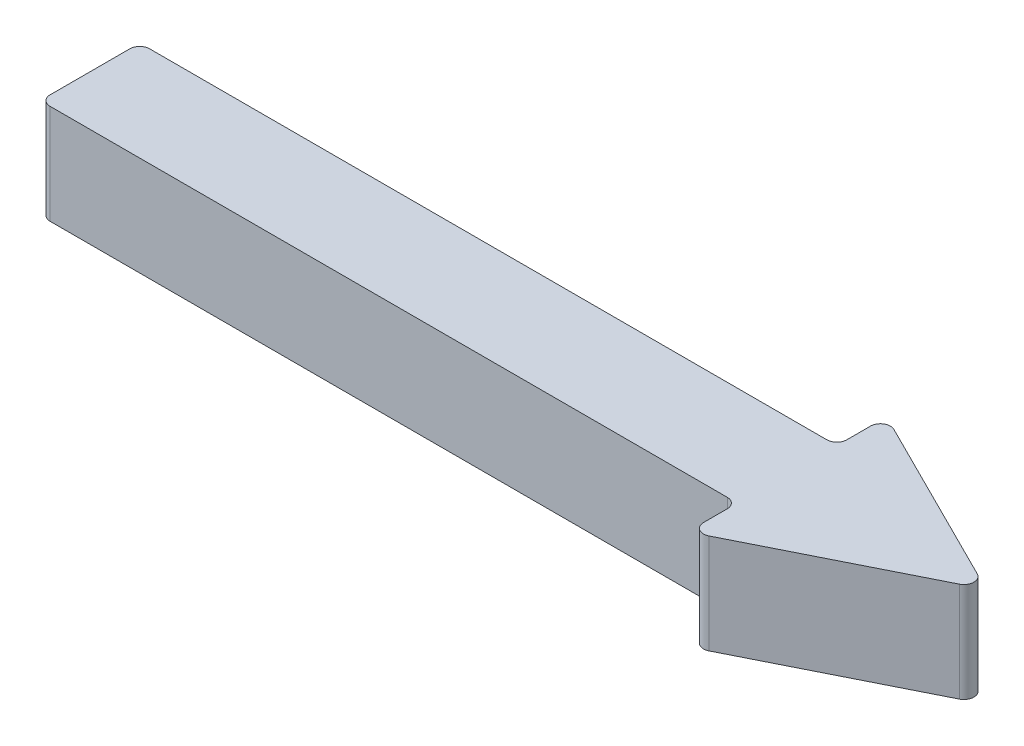
ISO-10303-21;
HEADER;
FILE_DESCRIPTION(('STEP AP214'),'2;1');
FILE_NAME('part.step','',(''),(''),'','','');
FILE_SCHEMA(('AUTOMOTIVE_DESIGN { 1 0 10303 214 1 1 1 1 }'));
ENDSEC;
DATA;
#1=APPLICATION_CONTEXT('core data for automotive mechanical design processes');
#2=APPLICATION_PROTOCOL_DEFINITION('international standard','automotive_design',2000,#1);
#3=PRODUCT_CONTEXT('',#1,'mechanical');
#4=PRODUCT('Part','Part','',(#3));
#5=PRODUCT_RELATED_PRODUCT_CATEGORY('part','',(#4));
#6=PRODUCT_DEFINITION_FORMATION('','',#4);
#7=PRODUCT_DEFINITION_CONTEXT('part definition',#1,'design');
#8=PRODUCT_DEFINITION('design','',#6,#7);
#9=PRODUCT_DEFINITION_SHAPE('','',#8);
#10=(LENGTH_UNIT() NAMED_UNIT(*) SI_UNIT(.MILLI.,.METRE.));
#11=(NAMED_UNIT(*) PLANE_ANGLE_UNIT() SI_UNIT($,.RADIAN.));
#12=(NAMED_UNIT(*) SI_UNIT($,.STERADIAN.) SOLID_ANGLE_UNIT());
#13=UNCERTAINTY_MEASURE_WITH_UNIT(LENGTH_MEASURE(1.E-05),#10,'distance_accuracy_value','');
#14=(GEOMETRIC_REPRESENTATION_CONTEXT(3) GLOBAL_UNCERTAINTY_ASSIGNED_CONTEXT((#13)) GLOBAL_UNIT_ASSIGNED_CONTEXT((#10,
#11,#12)) REPRESENTATION_CONTEXT('',''));
#15=CARTESIAN_POINT('',(0.,0.,0.));
#16=DIRECTION('',(0.,0.,1.));
#17=DIRECTION('',(1.,0.,0.));
#18=AXIS2_PLACEMENT_3D('',#15,#16,#17);
#19=CARTESIAN_POINT('',(0.,0.,0.));
#20=DIRECTION('',(0.,1.,0.));
#21=DIRECTION('',(0.,0.,1.));
#22=AXIS2_PLACEMENT_3D('',#19,#20,#21);
#23=PLANE('',#22);
#24=CARTESIAN_POINT('',(20.5625484171438,0.,-3.17500000000001));
#25=DIRECTION('',(0.,-1.,0.));
#26=DIRECTION('',(0.,0.,-1.));
#27=AXIS2_PLACEMENT_3D('',#24,#25,#26);
#28=CIRCLE('',#27,0.889);
#29=CARTESIAN_POINT('',(20.5625484171438,0.,-4.06400000000001));
#30=VERTEX_POINT('',#29);
#31=EDGE_CURVE('E266',#30,#30,#28,.T.);
#32=ORIENTED_EDGE('',*,*,#31,.F.);
#33=EDGE_LOOP('',(#32));
#34=FACE_BOUND('',#33,.T.);
#35=DIRECTION('',(1.,0.,0.));
#36=VECTOR('',#35,1.);
#37=CARTESIAN_POINT('',(0.,0.,0.));
#38=LINE('',#37,#36);
#39=CARTESIAN_POINT('',(0.635,0.,0.));
#40=VERTEX_POINT('',#39);
#41=CARTESIAN_POINT('',(43.815,0.,0.));
#42=VERTEX_POINT('',#41);
#43=EDGE_CURVE('E154',#40,#42,#38,.T.);
#44=ORIENTED_EDGE('',*,*,#43,.F.);
#45=CARTESIAN_POINT('',(0.635,0.,-0.635));
#46=DIRECTION('',(0.,1.,0.));
#47=DIRECTION('',(0.,0.,1.));
#48=AXIS2_PLACEMENT_3D('',#45,#46,#47);
#49=CIRCLE('',#48,0.635);
#50=CARTESIAN_POINT('',(0.,0.,-0.635));
#51=VERTEX_POINT('',#50);
#52=EDGE_CURVE('E137',#40,#51,#49,.F.);
#53=ORIENTED_EDGE('',*,*,#52,.T.);
#54=DIRECTION('',(0.,0.,-1.));
#55=VECTOR('',#54,1.);
#56=CARTESIAN_POINT('',(0.,0.,0.));
#57=LINE('',#56,#55);
#58=CARTESIAN_POINT('',(0.,0.,-5.715));
#59=VERTEX_POINT('',#58);
#60=EDGE_CURVE('E164',#51,#59,#57,.T.);
#61=ORIENTED_EDGE('',*,*,#60,.T.);
#62=CARTESIAN_POINT('',(0.635,0.,-5.715));
#63=DIRECTION('',(0.,1.,0.));
#64=DIRECTION('',(0.,0.,1.));
#65=AXIS2_PLACEMENT_3D('',#62,#63,#64);
#66=CIRCLE('',#65,0.635);
#67=CARTESIAN_POINT('',(0.635,0.,-6.35));
#68=VERTEX_POINT('',#67);
#69=EDGE_CURVE('E148',#59,#68,#66,.F.);
#70=ORIENTED_EDGE('',*,*,#69,.T.);
#71=DIRECTION('',(1.,0.,0.));
#72=VECTOR('',#71,1.);
#73=CARTESIAN_POINT('',(0.,0.,-6.35));
#74=LINE('',#73,#72);
#75=CARTESIAN_POINT('',(43.815,0.,-6.35));
#76=VERTEX_POINT('',#75);
#77=EDGE_CURVE('E180',#68,#76,#74,.T.);
#78=ORIENTED_EDGE('',*,*,#77,.T.);
#79=CARTESIAN_POINT('',(43.815,0.,-6.985));
#80=DIRECTION('',(0.,1.,0.));
#81=DIRECTION('',(0.,0.,1.));
#82=AXIS2_PLACEMENT_3D('',#79,#80,#81);
#83=CIRCLE('',#82,0.635);
#84=CARTESIAN_POINT('',(44.45,0.,-6.985));
#85=VERTEX_POINT('',#84);
#86=EDGE_CURVE('E229',#76,#85,#83,.T.);
#87=ORIENTED_EDGE('',*,*,#86,.T.);
#88=DIRECTION('',(0.,0.,-1.));
#89=VECTOR('',#88,1.);
#90=CARTESIAN_POINT('',(44.45,0.,0.));
#91=LINE('',#90,#89);
#92=CARTESIAN_POINT('',(44.45,0.,-8.49754841714382));
#93=VERTEX_POINT('',#92);
#94=EDGE_CURVE('E177',#85,#93,#91,.T.);
#95=ORIENTED_EDGE('',*,*,#94,.T.);
#96=CARTESIAN_POINT('',(45.085,0.,-8.49754841714382));
#97=DIRECTION('',(0.,1.,0.));
#98=DIRECTION('',(0.,0.,1.));
#99=AXIS2_PLACEMENT_3D('',#96,#97,#98);
#100=CIRCLE('',#99,0.635);
#101=CARTESIAN_POINT('',(45.3689806331425,0.,-9.06550968342878));
#102=VERTEX_POINT('',#101);
#103=EDGE_CURVE('E187',#93,#102,#100,.F.);
#104=ORIENTED_EDGE('',*,*,#103,.T.);
#105=DIRECTION('',(0.894427190999916,0.,0.447213595499958));
#106=VECTOR('',#105,1.);
#107=CARTESIAN_POINT('',(12.7,0.,-25.4));
#108=LINE('',#107,#106);
#109=CARTESIAN_POINT('',(56.0140774674301,0.,-3.74296126628495));
#110=VERTEX_POINT('',#109);
#111=EDGE_CURVE('E174',#102,#110,#108,.T.);
#112=ORIENTED_EDGE('',*,*,#111,.T.);
#113=CARTESIAN_POINT('',(55.7300968342876,0.,-3.175));
#114=DIRECTION('',(0.,1.,0.));
#115=DIRECTION('',(0.,0.,1.));
#116=AXIS2_PLACEMENT_3D('',#113,#114,#115);
#117=CIRCLE('',#116,0.635);
#118=CARTESIAN_POINT('',(56.0140774674301,0.,-2.60703873371505));
#119=VERTEX_POINT('',#118);
#120=EDGE_CURVE('E158',#110,#119,#117,.F.);
#121=ORIENTED_EDGE('',*,*,#120,.T.);
#122=DIRECTION('',(-0.894427190999916,0.,0.447213595499957));
#123=VECTOR('',#122,1.);
#124=CARTESIAN_POINT('',(10.16,0.,20.32));
#125=LINE('',#124,#123);
#126=CARTESIAN_POINT('',(45.3689806331425,0.,2.71550968342876));
#127=VERTEX_POINT('',#126);
#128=EDGE_CURVE('E166',#119,#127,#125,.T.);
#129=ORIENTED_EDGE('',*,*,#128,.T.);
#130=CARTESIAN_POINT('',(45.085,0.,2.14754841714381));
#131=DIRECTION('',(0.,1.,0.));
#132=DIRECTION('',(0.,0.,1.));
#133=AXIS2_PLACEMENT_3D('',#130,#131,#132);
#134=CIRCLE('',#133,0.635);
#135=CARTESIAN_POINT('',(44.45,0.,2.14754841714381));
#136=VERTEX_POINT('',#135);
#137=EDGE_CURVE('E189',#127,#136,#134,.F.);
#138=ORIENTED_EDGE('',*,*,#137,.T.);
#139=DIRECTION('',(0.,0.,-1.));
#140=VECTOR('',#139,1.);
#141=CARTESIAN_POINT('',(44.45,0.,0.));
#142=LINE('',#141,#140);
#143=CARTESIAN_POINT('',(44.45,0.,0.634999999999984));
#144=VERTEX_POINT('',#143);
#145=EDGE_CURVE('E163',#136,#144,#142,.T.);
#146=ORIENTED_EDGE('',*,*,#145,.T.);
#147=CARTESIAN_POINT('',(43.815,0.,0.634999999999984));
#148=DIRECTION('',(0.,1.,0.));
#149=DIRECTION('',(0.,0.,1.));
#150=AXIS2_PLACEMENT_3D('',#147,#148,#149);
#151=CIRCLE('',#150,0.635);
#152=EDGE_CURVE('E43',#144,#42,#151,.T.);
#153=ORIENTED_EDGE('',*,*,#152,.T.);
#154=EDGE_LOOP('',(#44,#53,#61,#70,#78,#87,#95,#104,#112,#121,#129,#138,#146,#153));
#155=FACE_BOUND('',#154,.T.);
#156=CARTESIAN_POINT('',(35.8025484171438,0.,-3.17500000000001));
#157=DIRECTION('',(0.,1.,0.));
#158=DIRECTION('',(0.,0.,1.));
#159=AXIS2_PLACEMENT_3D('',#156,#157,#158);
#160=CIRCLE('',#159,0.888999999999996);
#161=CARTESIAN_POINT('',(35.8025484171438,0.,-4.064));
#162=VERTEX_POINT('',#161);
#163=EDGE_CURVE('E269',#162,#162,#160,.T.);
#164=ORIENTED_EDGE('',*,*,#163,.T.);
#165=EDGE_LOOP('',(#164));
#166=FACE_BOUND('',#165,.T.);
#167=ADVANCED_FACE('F35',(#34,#155,#166),#23,.F.);
#168=CARTESIAN_POINT('',(0.,6.35,0.));
#169=DIRECTION('',(-1.,0.,0.));
#170=DIRECTION('',(0.,0.,1.));
#171=AXIS2_PLACEMENT_3D('',#168,#169,#170);
#172=PLANE('',#171);
#173=CARTESIAN_POINT('',(0.,3.175,-3.175));
#174=DIRECTION('',(-1.,0.,0.));
#175=DIRECTION('',(0.,0.,1.));
#176=AXIS2_PLACEMENT_3D('',#173,#174,#175);
#177=CIRCLE('',#176,2.4003);
#178=CARTESIAN_POINT('',(0.,3.175,-0.774700000000001));
#179=VERTEX_POINT('',#178);
#180=EDGE_CURVE('E257',#179,#179,#177,.T.);
#181=ORIENTED_EDGE('',*,*,#180,.F.);
#182=EDGE_LOOP('',(#181));
#183=FACE_BOUND('',#182,.T.);
#184=ORIENTED_EDGE('',*,*,#60,.F.);
#185=DIRECTION('',(0.,-1.,0.));
#186=VECTOR('',#185,1.);
#187=CARTESIAN_POINT('',(0.,6.35,-0.635));
#188=LINE('',#187,#186);
#189=CARTESIAN_POINT('',(0.,6.35,-0.635));
#190=VERTEX_POINT('',#189);
#191=EDGE_CURVE('E142',#51,#190,#188,.F.);
#192=ORIENTED_EDGE('',*,*,#191,.T.);
#193=DIRECTION('',(0.,0.,-1.));
#194=VECTOR('',#193,1.);
#195=CARTESIAN_POINT('',(0.,6.35,0.));
#196=LINE('',#195,#194);
#197=CARTESIAN_POINT('',(0.,6.35,-5.715));
#198=VERTEX_POINT('',#197);
#199=EDGE_CURVE('E183',#190,#198,#196,.T.);
#200=ORIENTED_EDGE('',*,*,#199,.T.);
#201=DIRECTION('',(0.,-1.,0.));
#202=VECTOR('',#201,1.);
#203=CARTESIAN_POINT('',(0.,6.35,-5.715));
#204=LINE('',#203,#202);
#205=EDGE_CURVE('E147',#198,#59,#204,.T.);
#206=ORIENTED_EDGE('',*,*,#205,.T.);
#207=EDGE_LOOP('',(#184,#192,#200,#206));
#208=FACE_BOUND('',#207,.T.);
#209=ADVANCED_FACE('F287',(#183,#208),#172,.T.);
#210=CARTESIAN_POINT('',(0.,6.35,0.));
#211=DIRECTION('',(0.,0.,-1.));
#212=DIRECTION('',(-1.,0.,0.));
#213=AXIS2_PLACEMENT_3D('',#210,#211,#212);
#214=PLANE('',#213);
#215=DIRECTION('',(1.,0.,0.));
#216=VECTOR('',#215,1.);
#217=CARTESIAN_POINT('',(0.,6.35,0.));
#218=LINE('',#217,#216);
#219=CARTESIAN_POINT('',(0.635,6.35,0.));
#220=VERTEX_POINT('',#219);
#221=CARTESIAN_POINT('',(43.815,6.35,0.));
#222=VERTEX_POINT('',#221);
#223=EDGE_CURVE('E157',#220,#222,#218,.T.);
#224=ORIENTED_EDGE('',*,*,#223,.F.);
#225=DIRECTION('',(0.,-1.,0.));
#226=VECTOR('',#225,1.);
#227=CARTESIAN_POINT('',(0.635,0.,0.));
#228=LINE('',#227,#226);
#229=EDGE_CURVE('E141',#220,#40,#228,.T.);
#230=ORIENTED_EDGE('',*,*,#229,.T.);
#231=ORIENTED_EDGE('',*,*,#43,.T.);
#232=DIRECTION('',(0.,-1.,0.));
#233=VECTOR('',#232,1.);
#234=CARTESIAN_POINT('',(43.815,6.35,0.));
#235=LINE('',#234,#233);
#236=EDGE_CURVE('E159',#42,#222,#235,.F.);
#237=ORIENTED_EDGE('',*,*,#236,.T.);
#238=EDGE_LOOP('',(#224,#230,#231,#237));
#239=FACE_BOUND('',#238,.T.);
#240=ADVANCED_FACE('F153',(#239),#214,.F.);
#241=CARTESIAN_POINT('',(44.45,6.35,0.));
#242=DIRECTION('',(-1.,0.,0.));
#243=DIRECTION('',(0.,0.,1.));
#244=AXIS2_PLACEMENT_3D('',#241,#242,#243);
#245=PLANE('',#244);
#246=DIRECTION('',(0.,0.,-1.));
#247=VECTOR('',#246,1.);
#248=CARTESIAN_POINT('',(44.45,6.35,0.));
#249=LINE('',#248,#247);
#250=CARTESIAN_POINT('',(44.45,6.35,2.14754841714381));
#251=VERTEX_POINT('',#250);
#252=CARTESIAN_POINT('',(44.45,6.35,0.634999999999984));
#253=VERTEX_POINT('',#252);
#254=EDGE_CURVE('E251',#251,#253,#249,.T.);
#255=ORIENTED_EDGE('',*,*,#254,.T.);
#256=DIRECTION('',(0.,-1.,0.));
#257=VECTOR('',#256,1.);
#258=CARTESIAN_POINT('',(44.45,6.35,0.634999999999984));
#259=LINE('',#258,#257);
#260=EDGE_CURVE('E216',#253,#144,#259,.T.);
#261=ORIENTED_EDGE('',*,*,#260,.T.);
#262=ORIENTED_EDGE('',*,*,#145,.F.);
#263=DIRECTION('',(0.,-1.,0.));
#264=VECTOR('',#263,1.);
#265=CARTESIAN_POINT('',(44.45,6.35,2.14754841714381));
#266=LINE('',#265,#264);
#267=EDGE_CURVE('E214',#136,#251,#266,.F.);
#268=ORIENTED_EDGE('',*,*,#267,.T.);
#269=EDGE_LOOP('',(#255,#261,#262,#268));
#270=FACE_BOUND('',#269,.T.);
#271=ADVANCED_FACE('F311',(#270),#245,.T.);
#272=CARTESIAN_POINT('',(10.16,6.35,20.32));
#273=DIRECTION('',(0.447213595499957,0.,0.894427190999916));
#274=DIRECTION('',(0.894427190999916,0.,-0.447213595499957));
#275=AXIS2_PLACEMENT_3D('',#272,#273,#274);
#276=PLANE('',#275);
#277=DIRECTION('',(-0.894427190999916,0.,0.447213595499957));
#278=VECTOR('',#277,1.);
#279=CARTESIAN_POINT('',(10.16,6.35,20.32));
#280=LINE('',#279,#278);
#281=CARTESIAN_POINT('',(56.0140774674301,6.35,-2.60703873371505));
#282=VERTEX_POINT('',#281);
#283=CARTESIAN_POINT('',(45.3689806331425,6.35,2.71550968342876));
#284=VERTEX_POINT('',#283);
#285=EDGE_CURVE('E248',#282,#284,#280,.T.);
#286=ORIENTED_EDGE('',*,*,#285,.T.);
#287=DIRECTION('',(0.,-1.,0.));
#288=VECTOR('',#287,1.);
#289=CARTESIAN_POINT('',(45.3689806331425,6.35,2.71550968342876));
#290=LINE('',#289,#288);
#291=EDGE_CURVE('E221',#284,#127,#290,.T.);
#292=ORIENTED_EDGE('',*,*,#291,.T.);
#293=ORIENTED_EDGE('',*,*,#128,.F.);
#294=DIRECTION('',(0.,-1.,0.));
#295=VECTOR('',#294,1.);
#296=CARTESIAN_POINT('',(56.0140774674301,6.35,-2.60703873371505));
#297=LINE('',#296,#295);
#298=EDGE_CURVE('E219',#119,#282,#297,.F.);
#299=ORIENTED_EDGE('',*,*,#298,.T.);
#300=EDGE_LOOP('',(#286,#292,#293,#299));
#301=FACE_BOUND('',#300,.T.);
#302=ADVANCED_FACE('F307',(#301),#276,.T.);
#303=CARTESIAN_POINT('',(12.7,6.35,-25.4));
#304=DIRECTION('',(0.447213595499958,0.,-0.894427190999916));
#305=DIRECTION('',(-0.894427190999916,0.,-0.447213595499958));
#306=AXIS2_PLACEMENT_3D('',#303,#304,#305);
#307=PLANE('',#306);
#308=ORIENTED_EDGE('',*,*,#111,.F.);
#309=DIRECTION('',(0.,-1.,0.));
#310=VECTOR('',#309,1.);
#311=CARTESIAN_POINT('',(45.3689806331425,6.35,-9.06550968342878));
#312=LINE('',#311,#310);
#313=CARTESIAN_POINT('',(45.3689806331425,6.35,-9.06550968342878));
#314=VERTEX_POINT('',#313);
#315=EDGE_CURVE('E227',#102,#314,#312,.F.);
#316=ORIENTED_EDGE('',*,*,#315,.T.);
#317=DIRECTION('',(0.894427190999916,0.,0.447213595499958));
#318=VECTOR('',#317,1.);
#319=CARTESIAN_POINT('',(12.7,6.35,-25.4));
#320=LINE('',#319,#318);
#321=CARTESIAN_POINT('',(56.0140774674301,6.35,-3.74296126628495));
#322=VERTEX_POINT('',#321);
#323=EDGE_CURVE('E243',#314,#322,#320,.T.);
#324=ORIENTED_EDGE('',*,*,#323,.T.);
#325=DIRECTION('',(0.,-1.,0.));
#326=VECTOR('',#325,1.);
#327=CARTESIAN_POINT('',(56.0140774674301,6.35,-3.74296126628495));
#328=LINE('',#327,#326);
#329=EDGE_CURVE('E224',#322,#110,#328,.T.);
#330=ORIENTED_EDGE('',*,*,#329,.T.);
#331=EDGE_LOOP('',(#308,#316,#324,#330));
#332=FACE_BOUND('',#331,.T.);
#333=ADVANCED_FACE('F304',(#332),#307,.T.);
#334=CARTESIAN_POINT('',(44.45,6.35,0.));
#335=DIRECTION('',(-1.,0.,0.));
#336=DIRECTION('',(0.,0.,1.));
#337=AXIS2_PLACEMENT_3D('',#334,#335,#336);
#338=PLANE('',#337);
#339=ORIENTED_EDGE('',*,*,#94,.F.);
#340=DIRECTION('',(0.,-1.,0.));
#341=VECTOR('',#340,1.);
#342=CARTESIAN_POINT('',(44.45,6.35,-6.985));
#343=LINE('',#342,#341);
#344=CARTESIAN_POINT('',(44.45,6.35,-6.985));
#345=VERTEX_POINT('',#344);
#346=EDGE_CURVE('E212',#85,#345,#343,.F.);
#347=ORIENTED_EDGE('',*,*,#346,.T.);
#348=DIRECTION('',(0.,0.,-1.));
#349=VECTOR('',#348,1.);
#350=CARTESIAN_POINT('',(44.45,6.35,0.));
#351=LINE('',#350,#349);
#352=CARTESIAN_POINT('',(44.45,6.35,-8.49754841714382));
#353=VERTEX_POINT('',#352);
#354=EDGE_CURVE('E242',#345,#353,#351,.T.);
#355=ORIENTED_EDGE('',*,*,#354,.T.);
#356=DIRECTION('',(0.,-1.,0.));
#357=VECTOR('',#356,1.);
#358=CARTESIAN_POINT('',(44.45,6.35,-8.49754841714382));
#359=LINE('',#358,#357);
#360=EDGE_CURVE('E209',#353,#93,#359,.T.);
#361=ORIENTED_EDGE('',*,*,#360,.T.);
#362=EDGE_LOOP('',(#339,#347,#355,#361));
#363=FACE_BOUND('',#362,.T.);
#364=ADVANCED_FACE('F236',(#363),#338,.T.);
#365=CARTESIAN_POINT('',(0.,6.35,-6.35));
#366=DIRECTION('',(0.,0.,-1.));
#367=DIRECTION('',(-1.,0.,0.));
#368=AXIS2_PLACEMENT_3D('',#365,#366,#367);
#369=PLANE('',#368);
#370=ORIENTED_EDGE('',*,*,#77,.F.);
#371=DIRECTION('',(0.,-1.,0.));
#372=VECTOR('',#371,1.);
#373=CARTESIAN_POINT('',(0.635,6.35,-6.35));
#374=LINE('',#373,#372);
#375=CARTESIAN_POINT('',(0.635,6.35,-6.35));
#376=VERTEX_POINT('',#375);
#377=EDGE_CURVE('E57',#68,#376,#374,.F.);
#378=ORIENTED_EDGE('',*,*,#377,.T.);
#379=DIRECTION('',(1.,0.,0.));
#380=VECTOR('',#379,1.);
#381=CARTESIAN_POINT('',(0.,6.35,-6.35));
#382=LINE('',#381,#380);
#383=CARTESIAN_POINT('',(43.815,6.35,-6.35));
#384=VERTEX_POINT('',#383);
#385=EDGE_CURVE('E184',#376,#384,#382,.T.);
#386=ORIENTED_EDGE('',*,*,#385,.T.);
#387=DIRECTION('',(0.,-1.,0.));
#388=VECTOR('',#387,1.);
#389=CARTESIAN_POINT('',(43.815,0.,-6.35));
#390=LINE('',#389,#388);
#391=EDGE_CURVE('E205',#384,#76,#390,.T.);
#392=ORIENTED_EDGE('',*,*,#391,.T.);
#393=EDGE_LOOP('',(#370,#378,#386,#392));
#394=FACE_BOUND('',#393,.T.);
#395=ADVANCED_FACE('F240',(#394),#369,.T.);
#396=CARTESIAN_POINT('',(0.,6.35,0.));
#397=DIRECTION('',(0.,1.,0.));
#398=DIRECTION('',(0.,0.,1.));
#399=AXIS2_PLACEMENT_3D('',#396,#397,#398);
#400=PLANE('',#399);
#401=ORIENTED_EDGE('',*,*,#199,.F.);
#402=CARTESIAN_POINT('',(0.635,6.35,-0.635));
#403=DIRECTION('',(0.,1.,0.));
#404=DIRECTION('',(0.,0.,1.));
#405=AXIS2_PLACEMENT_3D('',#402,#403,#404);
#406=CIRCLE('',#405,0.635);
#407=EDGE_CURVE('E203',#190,#220,#406,.T.);
#408=ORIENTED_EDGE('',*,*,#407,.T.);
#409=ORIENTED_EDGE('',*,*,#223,.T.);
#410=CARTESIAN_POINT('',(43.815,6.35,0.634999999999984));
#411=DIRECTION('',(0.,1.,0.));
#412=DIRECTION('',(0.,0.,1.));
#413=AXIS2_PLACEMENT_3D('',#410,#411,#412);
#414=CIRCLE('',#413,0.635);
#415=EDGE_CURVE('E11',#222,#253,#414,.F.);
#416=ORIENTED_EDGE('',*,*,#415,.T.);
#417=ORIENTED_EDGE('',*,*,#254,.F.);
#418=CARTESIAN_POINT('',(45.085,6.35,2.14754841714381));
#419=DIRECTION('',(0.,1.,0.));
#420=DIRECTION('',(0.,0.,1.));
#421=AXIS2_PLACEMENT_3D('',#418,#419,#420);
#422=CIRCLE('',#421,0.635);
#423=EDGE_CURVE('E199',#251,#284,#422,.T.);
#424=ORIENTED_EDGE('',*,*,#423,.T.);
#425=ORIENTED_EDGE('',*,*,#285,.F.);
#426=CARTESIAN_POINT('',(55.7300968342876,6.35,-3.175));
#427=DIRECTION('',(0.,1.,0.));
#428=DIRECTION('',(0.,0.,1.));
#429=AXIS2_PLACEMENT_3D('',#426,#427,#428);
#430=CIRCLE('',#429,0.635);
#431=EDGE_CURVE('E195',#282,#322,#430,.T.);
#432=ORIENTED_EDGE('',*,*,#431,.T.);
#433=ORIENTED_EDGE('',*,*,#323,.F.);
#434=CARTESIAN_POINT('',(45.085,6.35,-8.49754841714382));
#435=DIRECTION('',(0.,1.,0.));
#436=DIRECTION('',(0.,0.,1.));
#437=AXIS2_PLACEMENT_3D('',#434,#435,#436);
#438=CIRCLE('',#437,0.635);
#439=EDGE_CURVE('E197',#314,#353,#438,.T.);
#440=ORIENTED_EDGE('',*,*,#439,.T.);
#441=ORIENTED_EDGE('',*,*,#354,.F.);
#442=CARTESIAN_POINT('',(43.815,6.35,-6.985));
#443=DIRECTION('',(0.,1.,0.));
#444=DIRECTION('',(0.,0.,1.));
#445=AXIS2_PLACEMENT_3D('',#442,#443,#444);
#446=CIRCLE('',#445,0.635);
#447=EDGE_CURVE('E50',#345,#384,#446,.F.);
#448=ORIENTED_EDGE('',*,*,#447,.T.);
#449=ORIENTED_EDGE('',*,*,#385,.F.);
#450=CARTESIAN_POINT('',(0.635,6.35,-5.715));
#451=DIRECTION('',(0.,1.,0.));
#452=DIRECTION('',(0.,0.,1.));
#453=AXIS2_PLACEMENT_3D('',#450,#451,#452);
#454=CIRCLE('',#453,0.635);
#455=EDGE_CURVE('E201',#376,#198,#454,.T.);
#456=ORIENTED_EDGE('',*,*,#455,.T.);
#457=EDGE_LOOP('',(#401,#408,#409,#416,#417,#424,#425,#432,#433,#440,#441,#448,#449,#456));
#458=FACE_BOUND('',#457,.T.);
#459=ADVANCED_FACE('F298',(#458),#400,.T.);
#460=CARTESIAN_POINT('',(8.89,3.175,-3.175));
#461=DIRECTION('',(-1.,0.,0.));
#462=DIRECTION('',(0.,0.,1.));
#463=AXIS2_PLACEMENT_3D('',#460,#461,#462);
#464=CYLINDRICAL_SURFACE('',#463,2.4003);
#465=CARTESIAN_POINT('',(8.89,3.175,-3.175));
#466=DIRECTION('',(-1.,0.,0.));
#467=DIRECTION('',(0.,0.,1.));
#468=AXIS2_PLACEMENT_3D('',#465,#466,#467);
#469=CIRCLE('',#468,2.4003);
#470=CARTESIAN_POINT('',(8.89,3.175,-0.774700000000001));
#471=VERTEX_POINT('',#470);
#472=EDGE_CURVE('E168',#471,#471,#469,.T.);
#473=ORIENTED_EDGE('',*,*,#472,.F.);
#474=EDGE_LOOP('',(#473));
#475=FACE_BOUND('',#474,.T.);
#476=ORIENTED_EDGE('',*,*,#180,.T.);
#477=EDGE_LOOP('',(#476));
#478=FACE_BOUND('',#477,.T.);
#479=ADVANCED_FACE('F362',(#475,#478),#464,.F.);
#480=CARTESIAN_POINT('',(8.89,3.175,-3.175));
#481=DIRECTION('',(-1.,0.,0.));
#482=DIRECTION('',(0.,0.,1.));
#483=AXIS2_PLACEMENT_3D('',#480,#481,#482);
#484=PLANE('',#483);
#485=ORIENTED_EDGE('',*,*,#472,.T.);
#486=EDGE_LOOP('',(#485));
#487=FACE_BOUND('',#486,.T.);
#488=ADVANCED_FACE('F321',(#487),#484,.T.);
#489=CARTESIAN_POINT('',(0.635,6.35,-0.635));
#490=DIRECTION('',(0.,1.,0.));
#491=DIRECTION('',(0.,0.,1.));
#492=AXIS2_PLACEMENT_3D('',#489,#490,#491);
#493=CYLINDRICAL_SURFACE('',#492,0.635);
#494=ORIENTED_EDGE('',*,*,#407,.F.);
#495=ORIENTED_EDGE('',*,*,#191,.F.);
#496=ORIENTED_EDGE('',*,*,#52,.F.);
#497=ORIENTED_EDGE('',*,*,#229,.F.);
#498=EDGE_LOOP('',(#494,#495,#496,#497));
#499=FACE_BOUND('',#498,.T.);
#500=ADVANCED_FACE('F140',(#499),#493,.T.);
#501=CARTESIAN_POINT('',(0.635,6.35,-5.715));
#502=DIRECTION('',(0.,-1.,0.));
#503=DIRECTION('',(0.,0.,-1.));
#504=AXIS2_PLACEMENT_3D('',#501,#502,#503);
#505=CYLINDRICAL_SURFACE('',#504,0.635);
#506=ORIENTED_EDGE('',*,*,#455,.F.);
#507=ORIENTED_EDGE('',*,*,#377,.F.);
#508=ORIENTED_EDGE('',*,*,#69,.F.);
#509=ORIENTED_EDGE('',*,*,#205,.F.);
#510=EDGE_LOOP('',(#506,#507,#508,#509));
#511=FACE_BOUND('',#510,.T.);
#512=ADVANCED_FACE('F320',(#511),#505,.T.);
#513=CARTESIAN_POINT('',(43.815,6.35,-6.985));
#514=DIRECTION('',(0.,1.,0.));
#515=DIRECTION('',(0.,0.,1.));
#516=AXIS2_PLACEMENT_3D('',#513,#514,#515);
#517=CYLINDRICAL_SURFACE('',#516,0.635);
#518=ORIENTED_EDGE('',*,*,#447,.F.);
#519=ORIENTED_EDGE('',*,*,#346,.F.);
#520=ORIENTED_EDGE('',*,*,#86,.F.);
#521=ORIENTED_EDGE('',*,*,#391,.F.);
#522=EDGE_LOOP('',(#518,#519,#520,#521));
#523=FACE_BOUND('',#522,.T.);
#524=ADVANCED_FACE('F239',(#523),#517,.F.);
#525=CARTESIAN_POINT('',(43.815,6.35,0.634999999999984));
#526=DIRECTION('',(0.,-1.,0.));
#527=DIRECTION('',(0.,0.,-1.));
#528=AXIS2_PLACEMENT_3D('',#525,#526,#527);
#529=CYLINDRICAL_SURFACE('',#528,0.635);
#530=ORIENTED_EDGE('',*,*,#415,.F.);
#531=ORIENTED_EDGE('',*,*,#236,.F.);
#532=ORIENTED_EDGE('',*,*,#152,.F.);
#533=ORIENTED_EDGE('',*,*,#260,.F.);
#534=EDGE_LOOP('',(#530,#531,#532,#533));
#535=FACE_BOUND('',#534,.T.);
#536=ADVANCED_FACE('F327',(#535),#529,.F.);
#537=CARTESIAN_POINT('',(45.085,6.35,2.14754841714381));
#538=DIRECTION('',(0.,-1.,0.));
#539=DIRECTION('',(0.,0.,-1.));
#540=AXIS2_PLACEMENT_3D('',#537,#538,#539);
#541=CYLINDRICAL_SURFACE('',#540,0.635);
#542=ORIENTED_EDGE('',*,*,#423,.F.);
#543=ORIENTED_EDGE('',*,*,#267,.F.);
#544=ORIENTED_EDGE('',*,*,#137,.F.);
#545=ORIENTED_EDGE('',*,*,#291,.F.);
#546=EDGE_LOOP('',(#542,#543,#544,#545));
#547=FACE_BOUND('',#546,.T.);
#548=ADVANCED_FACE('F330',(#547),#541,.T.);
#549=CARTESIAN_POINT('',(45.085,6.35,-8.49754841714382));
#550=DIRECTION('',(0.,-1.,0.));
#551=DIRECTION('',(0.,0.,-1.));
#552=AXIS2_PLACEMENT_3D('',#549,#550,#551);
#553=CYLINDRICAL_SURFACE('',#552,0.635);
#554=ORIENTED_EDGE('',*,*,#439,.F.);
#555=ORIENTED_EDGE('',*,*,#315,.F.);
#556=ORIENTED_EDGE('',*,*,#103,.F.);
#557=ORIENTED_EDGE('',*,*,#360,.F.);
#558=EDGE_LOOP('',(#554,#555,#556,#557));
#559=FACE_BOUND('',#558,.T.);
#560=ADVANCED_FACE('F333',(#559),#553,.T.);
#561=CARTESIAN_POINT('',(55.7300968342876,6.35,-3.175));
#562=DIRECTION('',(0.,-1.,0.));
#563=DIRECTION('',(0.,0.,-1.));
#564=AXIS2_PLACEMENT_3D('',#561,#562,#563);
#565=CYLINDRICAL_SURFACE('',#564,0.635);
#566=ORIENTED_EDGE('',*,*,#431,.F.);
#567=ORIENTED_EDGE('',*,*,#298,.F.);
#568=ORIENTED_EDGE('',*,*,#120,.F.);
#569=ORIENTED_EDGE('',*,*,#329,.F.);
#570=EDGE_LOOP('',(#566,#567,#568,#569));
#571=FACE_BOUND('',#570,.T.);
#572=ADVANCED_FACE('F37',(#571),#565,.T.);
#573=CARTESIAN_POINT('',(20.5625484171438,3.81,-3.17500000000001));
#574=DIRECTION('',(0.,-1.,0.));
#575=DIRECTION('',(0.,0.,-1.));
#576=AXIS2_PLACEMENT_3D('',#573,#574,#575);
#577=CYLINDRICAL_SURFACE('',#576,0.889);
#578=CARTESIAN_POINT('',(20.5625484171438,3.81,-3.17500000000001));
#579=DIRECTION('',(0.,-1.,0.));
#580=DIRECTION('',(0.,0.,-1.));
#581=AXIS2_PLACEMENT_3D('',#578,#579,#580);
#582=CIRCLE('',#581,0.889);
#583=CARTESIAN_POINT('',(20.5625484171438,3.81,-4.06400000000001));
#584=VERTEX_POINT('',#583);
#585=EDGE_CURVE('E263',#584,#584,#582,.T.);
#586=CARTESIAN_POINT('',(20.5625484171438,3.81,-4.06400000000001));
#587=CARTESIAN_POINT('',(20.5625484171438,3.7703125,-4.06400000000001));
#588=CARTESIAN_POINT('',(20.5625484171438,3.730625,-4.06400000000001));
#589=CARTESIAN_POINT('',(20.5625484171438,3.65125,-4.06400000000001));
#590=CARTESIAN_POINT('',(20.5625484171438,3.6115625,-4.06400000000001));
#591=CARTESIAN_POINT('',(20.5625484171438,3.5321875,-4.06400000000001));
#592=CARTESIAN_POINT('',(20.5625484171438,3.4925,-4.06400000000001));
#593=CARTESIAN_POINT('',(20.5625484171438,3.413125,-4.06400000000001));
#594=CARTESIAN_POINT('',(20.5625484171438,3.3734375,-4.06400000000001));
#595=CARTESIAN_POINT('',(20.5625484171438,3.2940625,-4.06400000000001));
#596=CARTESIAN_POINT('',(20.5625484171438,3.254375,-4.06400000000001));
#597=CARTESIAN_POINT('',(20.5625484171438,3.175,-4.06400000000001));
#598=CARTESIAN_POINT('',(20.5625484171438,3.1353125,-4.06400000000001));
#599=CARTESIAN_POINT('',(20.5625484171438,3.0559375,-4.06400000000001));
#600=CARTESIAN_POINT('',(20.5625484171438,3.01625,-4.06400000000001));
#601=CARTESIAN_POINT('',(20.5625484171438,2.936875,-4.06400000000001));
#602=CARTESIAN_POINT('',(20.5625484171438,2.8971875,-4.06400000000001));
#603=CARTESIAN_POINT('',(20.5625484171438,2.8178125,-4.06400000000001));
#604=CARTESIAN_POINT('',(20.5625484171438,2.778125,-4.06400000000001));
#605=CARTESIAN_POINT('',(20.5625484171438,2.69875,-4.06400000000001));
#606=CARTESIAN_POINT('',(20.5625484171438,2.6590625,-4.06400000000001));
#607=CARTESIAN_POINT('',(20.5625484171438,2.5796875,-4.06400000000001));
#608=CARTESIAN_POINT('',(20.5625484171438,2.54,-4.06400000000001));
#609=CARTESIAN_POINT('',(20.5625484171438,2.460625,-4.06400000000001));
#610=CARTESIAN_POINT('',(20.5625484171438,2.4209375,-4.06400000000001));
#611=CARTESIAN_POINT('',(20.5625484171438,2.3415625,-4.06400000000001));
#612=CARTESIAN_POINT('',(20.5625484171438,2.301875,-4.06400000000001));
#613=CARTESIAN_POINT('',(20.5625484171438,2.2225,-4.06400000000001));
#614=CARTESIAN_POINT('',(20.5625484171438,2.1828125,-4.06400000000001));
#615=CARTESIAN_POINT('',(20.5625484171438,2.1034375,-4.06400000000001));
#616=CARTESIAN_POINT('',(20.5625484171438,2.06375,-4.06400000000001));
#617=CARTESIAN_POINT('',(20.5625484171438,1.984375,-4.06400000000001));
#618=CARTESIAN_POINT('',(20.5625484171438,1.9446875,-4.06400000000001));
#619=CARTESIAN_POINT('',(20.5625484171438,1.8653125,-4.06400000000001));
#620=CARTESIAN_POINT('',(20.5625484171438,1.825625,-4.06400000000001));
#621=CARTESIAN_POINT('',(20.5625484171438,1.74625,-4.06400000000001));
#622=CARTESIAN_POINT('',(20.5625484171438,1.7065625,-4.06400000000001));
#623=CARTESIAN_POINT('',(20.5625484171438,1.6271875,-4.06400000000001));
#624=CARTESIAN_POINT('',(20.5625484171438,1.5875,-4.06400000000001));
#625=CARTESIAN_POINT('',(20.5625484171438,1.508125,-4.06400000000001));
#626=CARTESIAN_POINT('',(20.5625484171438,1.4684375,-4.06400000000001));
#627=CARTESIAN_POINT('',(20.5625484171438,1.3890625,-4.06400000000001));
#628=CARTESIAN_POINT('',(20.5625484171438,1.349375,-4.06400000000001));
#629=CARTESIAN_POINT('',(20.5625484171438,1.27,-4.06400000000001));
#630=CARTESIAN_POINT('',(20.5625484171438,1.2303125,-4.06400000000001));
#631=CARTESIAN_POINT('',(20.5625484171438,1.1509375,-4.06400000000001));
#632=CARTESIAN_POINT('',(20.5625484171438,1.11125,-4.06400000000001));
#633=CARTESIAN_POINT('',(20.5625484171438,1.031875,-4.06400000000001));
#634=CARTESIAN_POINT('',(20.5625484171438,0.9921875,-4.06400000000001));
#635=CARTESIAN_POINT('',(20.5625484171438,0.9128125,-4.06400000000001));
#636=CARTESIAN_POINT('',(20.5625484171438,0.873125,-4.06400000000001));
#637=CARTESIAN_POINT('',(20.5625484171438,0.79375,-4.06400000000001));
#638=CARTESIAN_POINT('',(20.5625484171438,0.7540625,-4.06400000000001));
#639=CARTESIAN_POINT('',(20.5625484171438,0.6746875,-4.06400000000001));
#640=CARTESIAN_POINT('',(20.5625484171438,0.635,-4.06400000000001));
#641=CARTESIAN_POINT('',(20.5625484171438,0.555625,-4.06400000000001));
#642=CARTESIAN_POINT('',(20.5625484171438,0.5159375,-4.06400000000001));
#643=CARTESIAN_POINT('',(20.5625484171438,0.4365625,-4.06400000000001));
#644=CARTESIAN_POINT('',(20.5625484171438,0.396875,-4.06400000000001));
#645=CARTESIAN_POINT('',(20.5625484171438,0.3175,-4.06400000000001));
#646=CARTESIAN_POINT('',(20.5625484171438,0.2778125,-4.06400000000001));
#647=CARTESIAN_POINT('',(20.5625484171438,0.1984375,-4.06400000000001));
#648=CARTESIAN_POINT('',(20.5625484171438,0.15875,-4.06400000000001));
#649=CARTESIAN_POINT('',(20.5625484171438,0.0793749999999999,-4.06400000000001));
#650=CARTESIAN_POINT('',(20.5625484171438,0.0396874999999999,-4.06400000000001));
#651=CARTESIAN_POINT('',(20.5625484171438,0.,-4.06400000000001));
#652=B_SPLINE_CURVE_WITH_KNOTS('',3,(#586,#587,#588,#589,#590,#591,#592,#593,#594,#595,#596,
#597,#598,#599,#600,#601,#602,#603,#604,#605,#606,#607,#608,#609,#610,#611,#612,#613,#614,#615,
#616,#617,#618,#619,#620,#621,#622,#623,#624,#625,#626,#627,#628,#629,#630,#631,#632,#633,#634,
#635,#636,#637,#638,#639,#640,#641,#642,#643,#644,#645,#646,#647,#648,#649,#650,#651),
.UNSPECIFIED.,.F.,.F.,(4,2,2,2,2,2,2,2,2,2,2,2,2,2,2,2,2,2,2,2,2,2,2,2,2,2,2,2,2,2,2,2,4),(0.,
0.1190625,0.238125,0.3571875,0.47625,0.5953125,0.714375,0.8334375,0.9525,1.0715625,1.190625,
1.3096875,1.42875,1.5478125,1.666875,1.7859375,1.905,2.0240625,2.143125,2.2621875,2.38125,
2.5003125,2.619375,2.7384375,2.8575,2.9765625,3.095625,3.2146875,3.33375,3.4528125,3.571875,
3.6909375,3.81),.UNSPECIFIED.);
#653=EDGE_CURVE('BSEAM340',#584,#30,#652,.T.);
#654=ORIENTED_EDGE('',*,*,#585,.F.);
#655=ORIENTED_EDGE('',*,*,#31,.T.);
#656=ORIENTED_EDGE('',*,*,#653,.T.);
#657=ORIENTED_EDGE('',*,*,#653,.F.);
#658=EDGE_LOOP('',(#654,#656,#655,#657));
#659=FACE_BOUND('',#658,.T.);
#660=ADVANCED_FACE('F340',(#659),#577,.F.);
#661=CARTESIAN_POINT('',(20.5625484171438,3.81,-3.17500000000001));
#662=DIRECTION('',(0.,-1.,0.));
#663=DIRECTION('',(0.,0.,-1.));
#664=AXIS2_PLACEMENT_3D('',#661,#662,#663);
#665=PLANE('',#664);
#666=ORIENTED_EDGE('',*,*,#585,.T.);
#667=EDGE_LOOP('',(#666));
#668=FACE_BOUND('',#667,.T.);
#669=ADVANCED_FACE('F284',(#668),#665,.T.);
#670=CARTESIAN_POINT('',(35.8025484171438,3.81,-3.17500000000001));
#671=DIRECTION('',(0.,-1.,0.));
#672=DIRECTION('',(0.,0.,-1.));
#673=AXIS2_PLACEMENT_3D('',#670,#671,#672);
#674=CYLINDRICAL_SURFACE('',#673,0.888999999999996);
#675=CARTESIAN_POINT('',(35.8025484171438,3.81,-3.17500000000001));
#676=DIRECTION('',(0.,1.,0.));
#677=DIRECTION('',(0.,0.,1.));
#678=AXIS2_PLACEMENT_3D('',#675,#676,#677);
#679=CIRCLE('',#678,0.888999999999996);
#680=CARTESIAN_POINT('',(35.8025484171438,3.81,-4.064));
#681=VERTEX_POINT('',#680);
#682=EDGE_CURVE('E260',#681,#681,#679,.T.);
#683=CARTESIAN_POINT('',(35.8025484171438,3.81,-4.064));
#684=CARTESIAN_POINT('',(35.8025484171438,3.7703125,-4.064));
#685=CARTESIAN_POINT('',(35.8025484171438,3.730625,-4.064));
#686=CARTESIAN_POINT('',(35.8025484171438,3.65125,-4.064));
#687=CARTESIAN_POINT('',(35.8025484171438,3.6115625,-4.064));
#688=CARTESIAN_POINT('',(35.8025484171438,3.5321875,-4.064));
#689=CARTESIAN_POINT('',(35.8025484171438,3.4925,-4.064));
#690=CARTESIAN_POINT('',(35.8025484171438,3.413125,-4.064));
#691=CARTESIAN_POINT('',(35.8025484171438,3.3734375,-4.064));
#692=CARTESIAN_POINT('',(35.8025484171438,3.2940625,-4.064));
#693=CARTESIAN_POINT('',(35.8025484171438,3.254375,-4.064));
#694=CARTESIAN_POINT('',(35.8025484171438,3.175,-4.064));
#695=CARTESIAN_POINT('',(35.8025484171438,3.1353125,-4.064));
#696=CARTESIAN_POINT('',(35.8025484171438,3.0559375,-4.064));
#697=CARTESIAN_POINT('',(35.8025484171438,3.01625,-4.064));
#698=CARTESIAN_POINT('',(35.8025484171438,2.936875,-4.064));
#699=CARTESIAN_POINT('',(35.8025484171438,2.8971875,-4.064));
#700=CARTESIAN_POINT('',(35.8025484171438,2.8178125,-4.064));
#701=CARTESIAN_POINT('',(35.8025484171438,2.778125,-4.064));
#702=CARTESIAN_POINT('',(35.8025484171438,2.69875,-4.064));
#703=CARTESIAN_POINT('',(35.8025484171438,2.6590625,-4.064));
#704=CARTESIAN_POINT('',(35.8025484171438,2.5796875,-4.064));
#705=CARTESIAN_POINT('',(35.8025484171438,2.54,-4.064));
#706=CARTESIAN_POINT('',(35.8025484171438,2.460625,-4.064));
#707=CARTESIAN_POINT('',(35.8025484171438,2.4209375,-4.064));
#708=CARTESIAN_POINT('',(35.8025484171438,2.3415625,-4.064));
#709=CARTESIAN_POINT('',(35.8025484171438,2.301875,-4.064));
#710=CARTESIAN_POINT('',(35.8025484171438,2.2225,-4.064));
#711=CARTESIAN_POINT('',(35.8025484171438,2.1828125,-4.064));
#712=CARTESIAN_POINT('',(35.8025484171438,2.1034375,-4.064));
#713=CARTESIAN_POINT('',(35.8025484171438,2.06375,-4.064));
#714=CARTESIAN_POINT('',(35.8025484171438,1.984375,-4.064));
#715=CARTESIAN_POINT('',(35.8025484171438,1.9446875,-4.064));
#716=CARTESIAN_POINT('',(35.8025484171438,1.8653125,-4.064));
#717=CARTESIAN_POINT('',(35.8025484171438,1.825625,-4.064));
#718=CARTESIAN_POINT('',(35.8025484171438,1.74625,-4.064));
#719=CARTESIAN_POINT('',(35.8025484171438,1.7065625,-4.064));
#720=CARTESIAN_POINT('',(35.8025484171438,1.6271875,-4.064));
#721=CARTESIAN_POINT('',(35.8025484171438,1.5875,-4.064));
#722=CARTESIAN_POINT('',(35.8025484171438,1.508125,-4.064));
#723=CARTESIAN_POINT('',(35.8025484171438,1.4684375,-4.064));
#724=CARTESIAN_POINT('',(35.8025484171438,1.3890625,-4.064));
#725=CARTESIAN_POINT('',(35.8025484171438,1.349375,-4.064));
#726=CARTESIAN_POINT('',(35.8025484171438,1.27,-4.064));
#727=CARTESIAN_POINT('',(35.8025484171438,1.2303125,-4.064));
#728=CARTESIAN_POINT('',(35.8025484171438,1.1509375,-4.064));
#729=CARTESIAN_POINT('',(35.8025484171438,1.11125,-4.064));
#730=CARTESIAN_POINT('',(35.8025484171438,1.031875,-4.064));
#731=CARTESIAN_POINT('',(35.8025484171438,0.9921875,-4.064));
#732=CARTESIAN_POINT('',(35.8025484171438,0.9128125,-4.064));
#733=CARTESIAN_POINT('',(35.8025484171438,0.873125,-4.064));
#734=CARTESIAN_POINT('',(35.8025484171438,0.79375,-4.064));
#735=CARTESIAN_POINT('',(35.8025484171438,0.7540625,-4.064));
#736=CARTESIAN_POINT('',(35.8025484171438,0.6746875,-4.064));
#737=CARTESIAN_POINT('',(35.8025484171438,0.635,-4.064));
#738=CARTESIAN_POINT('',(35.8025484171438,0.555625,-4.064));
#739=CARTESIAN_POINT('',(35.8025484171438,0.5159375,-4.064));
#740=CARTESIAN_POINT('',(35.8025484171438,0.4365625,-4.064));
#741=CARTESIAN_POINT('',(35.8025484171438,0.396875,-4.064));
#742=CARTESIAN_POINT('',(35.8025484171438,0.3175,-4.064));
#743=CARTESIAN_POINT('',(35.8025484171438,0.2778125,-4.064));
#744=CARTESIAN_POINT('',(35.8025484171438,0.1984375,-4.064));
#745=CARTESIAN_POINT('',(35.8025484171438,0.15875,-4.064));
#746=CARTESIAN_POINT('',(35.8025484171438,0.0793749999999999,-4.064));
#747=CARTESIAN_POINT('',(35.8025484171438,0.0396874999999999,-4.064));
#748=CARTESIAN_POINT('',(35.8025484171438,0.,-4.064));
#749=B_SPLINE_CURVE_WITH_KNOTS('',3,(#683,#684,#685,#686,#687,#688,#689,#690,#691,#692,#693,
#694,#695,#696,#697,#698,#699,#700,#701,#702,#703,#704,#705,#706,#707,#708,#709,#710,#711,#712,
#713,#714,#715,#716,#717,#718,#719,#720,#721,#722,#723,#724,#725,#726,#727,#728,#729,#730,#731,
#732,#733,#734,#735,#736,#737,#738,#739,#740,#741,#742,#743,#744,#745,#746,#747,#748),
.UNSPECIFIED.,.F.,.F.,(4,2,2,2,2,2,2,2,2,2,2,2,2,2,2,2,2,2,2,2,2,2,2,2,2,2,2,2,2,2,2,2,4),(0.,
0.1190625,0.238125,0.3571875,0.47625,0.5953125,0.714375,0.8334375,0.9525,1.0715625,1.190625,
1.3096875,1.42875,1.5478125,1.666875,1.7859375,1.905,2.0240625,2.143125,2.2621875,2.38125,
2.5003125,2.619375,2.7384375,2.8575,2.9765625,3.095625,3.2146875,3.33375,3.4528125,3.571875,
3.6909375,3.81),.UNSPECIFIED.);
#750=EDGE_CURVE('BSEAM275',#681,#162,#749,.T.);
#751=ORIENTED_EDGE('',*,*,#682,.T.);
#752=ORIENTED_EDGE('',*,*,#163,.F.);
#753=ORIENTED_EDGE('',*,*,#750,.T.);
#754=ORIENTED_EDGE('',*,*,#750,.F.);
#755=EDGE_LOOP('',(#751,#753,#752,#754));
#756=FACE_BOUND('',#755,.T.);
#757=ADVANCED_FACE('F275',(#756),#674,.F.);
#758=CARTESIAN_POINT('',(35.8025484171438,3.81,-3.17500000000001));
#759=DIRECTION('',(0.,1.,0.));
#760=DIRECTION('',(0.,0.,1.));
#761=AXIS2_PLACEMENT_3D('',#758,#759,#760);
#762=PLANE('',#761);
#763=ORIENTED_EDGE('',*,*,#682,.F.);
#764=EDGE_LOOP('',(#763));
#765=FACE_BOUND('',#764,.T.);
#766=ADVANCED_FACE('F278',(#765),#762,.F.);
#767=CLOSED_SHELL('',(#167,#209,#240,#271,#302,#333,#364,#395,#459,#479,#488,#500,#512,#524,
#536,#548,#560,#572,#660,#669,#757,#766));
#768=MANIFOLD_SOLID_BREP('B2',#767);
#769=ADVANCED_BREP_SHAPE_REPRESENTATION('',(#18,#768),#14);
#770=SHAPE_DEFINITION_REPRESENTATION(#9,#769);
ENDSEC;
END-ISO-10303-21;
